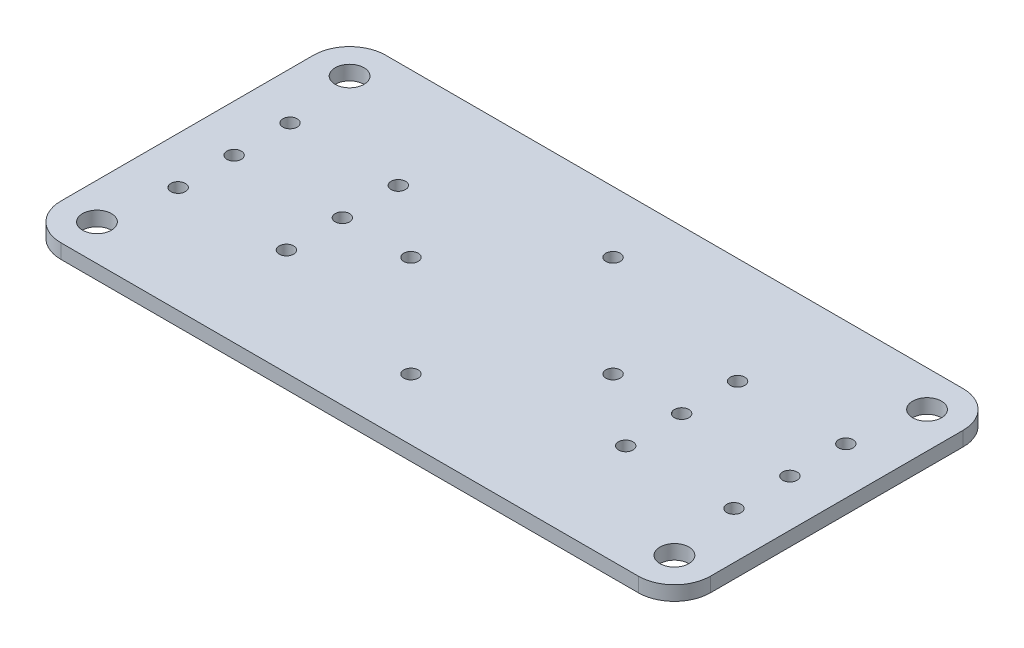
ISO-10303-21;
HEADER;
FILE_DESCRIPTION(('STEP AP214'),'2;1');
FILE_NAME('part.step','',(''),(''),'','','');
FILE_SCHEMA(('AUTOMOTIVE_DESIGN { 1 0 10303 214 1 1 1 1 }'));
ENDSEC;
DATA;
#1=APPLICATION_CONTEXT('core data for automotive mechanical design processes');
#2=APPLICATION_PROTOCOL_DEFINITION('international standard','automotive_design',2000,#1);
#3=PRODUCT_CONTEXT('',#1,'mechanical');
#4=PRODUCT('Part','Part','',(#3));
#5=PRODUCT_RELATED_PRODUCT_CATEGORY('part','',(#4));
#6=PRODUCT_DEFINITION_FORMATION('','',#4);
#7=PRODUCT_DEFINITION_CONTEXT('part definition',#1,'design');
#8=PRODUCT_DEFINITION('design','',#6,#7);
#9=PRODUCT_DEFINITION_SHAPE('','',#8);
#10=(LENGTH_UNIT() NAMED_UNIT(*) SI_UNIT(.MILLI.,.METRE.));
#11=(NAMED_UNIT(*) PLANE_ANGLE_UNIT() SI_UNIT($,.RADIAN.));
#12=(NAMED_UNIT(*) SI_UNIT($,.STERADIAN.) SOLID_ANGLE_UNIT());
#13=UNCERTAINTY_MEASURE_WITH_UNIT(LENGTH_MEASURE(1.E-05),#10,'distance_accuracy_value','');
#14=(GEOMETRIC_REPRESENTATION_CONTEXT(3) GLOBAL_UNCERTAINTY_ASSIGNED_CONTEXT((#13)) GLOBAL_UNIT_ASSIGNED_CONTEXT((#10,
#11,#12)) REPRESENTATION_CONTEXT('',''));
#15=CARTESIAN_POINT('',(0.,0.,0.));
#16=DIRECTION('',(0.,0.,1.));
#17=DIRECTION('',(1.,0.,0.));
#18=AXIS2_PLACEMENT_3D('',#15,#16,#17);
#19=CARTESIAN_POINT('',(90.,4.,45.));
#20=DIRECTION('',(-1.,0.,0.));
#21=DIRECTION('',(0.,0.,1.));
#22=AXIS2_PLACEMENT_3D('',#19,#20,#21);
#23=PLANE('',#22);
#24=DIRECTION('',(0.,0.,-1.));
#25=VECTOR('',#24,1.);
#26=CARTESIAN_POINT('',(90.,4.,45.));
#27=LINE('',#26,#25);
#28=CARTESIAN_POINT('',(90.,4.,35.));
#29=VERTEX_POINT('',#28);
#30=CARTESIAN_POINT('',(90.,4.,-35.));
#31=VERTEX_POINT('',#30);
#32=EDGE_CURVE('E122',#29,#31,#27,.T.);
#33=ORIENTED_EDGE('',*,*,#32,.F.);
#34=DIRECTION('',(0.,-1.,0.));
#35=VECTOR('',#34,1.);
#36=CARTESIAN_POINT('',(90.,4.,35.));
#37=LINE('',#36,#35);
#38=CARTESIAN_POINT('',(90.,0.,35.));
#39=VERTEX_POINT('',#38);
#40=EDGE_CURVE('E107',#29,#39,#37,.T.);
#41=ORIENTED_EDGE('',*,*,#40,.T.);
#42=DIRECTION('',(0.,0.,-1.));
#43=VECTOR('',#42,1.);
#44=CARTESIAN_POINT('',(90.,0.,45.));
#45=LINE('',#44,#43);
#46=CARTESIAN_POINT('',(90.,0.,-35.));
#47=VERTEX_POINT('',#46);
#48=EDGE_CURVE('E119',#39,#47,#45,.T.);
#49=ORIENTED_EDGE('',*,*,#48,.T.);
#50=DIRECTION('',(0.,-1.,0.));
#51=VECTOR('',#50,1.);
#52=CARTESIAN_POINT('',(90.,4.,-35.));
#53=LINE('',#52,#51);
#54=EDGE_CURVE('E124',#47,#31,#53,.F.);
#55=ORIENTED_EDGE('',*,*,#54,.T.);
#56=EDGE_LOOP('',(#33,#41,#49,#55));
#57=FACE_BOUND('',#56,.T.);
#58=ADVANCED_FACE('F37',(#57),#23,.F.);
#59=CARTESIAN_POINT('',(-90.,4.,-45.));
#60=DIRECTION('',(0.,0.,1.));
#61=DIRECTION('',(1.,0.,0.));
#62=AXIS2_PLACEMENT_3D('',#59,#60,#61);
#63=PLANE('',#62);
#64=DIRECTION('',(-1.,0.,0.));
#65=VECTOR('',#64,1.);
#66=CARTESIAN_POINT('',(-90.,4.,-45.));
#67=LINE('',#66,#65);
#68=CARTESIAN_POINT('',(79.9999999999999,4.,-45.));
#69=VERTEX_POINT('',#68);
#70=CARTESIAN_POINT('',(-80.,4.,-45.));
#71=VERTEX_POINT('',#70);
#72=EDGE_CURVE('E168',#69,#71,#67,.T.);
#73=ORIENTED_EDGE('',*,*,#72,.F.);
#74=DIRECTION('',(0.,-1.,0.));
#75=VECTOR('',#74,1.);
#76=CARTESIAN_POINT('',(80.,4.,-45.));
#77=LINE('',#76,#75);
#78=CARTESIAN_POINT('',(79.9999999999999,0.,-45.));
#79=VERTEX_POINT('',#78);
#80=EDGE_CURVE('E161',#69,#79,#77,.T.);
#81=ORIENTED_EDGE('',*,*,#80,.T.);
#82=DIRECTION('',(-1.,0.,0.));
#83=VECTOR('',#82,1.);
#84=CARTESIAN_POINT('',(-90.,0.,-45.));
#85=LINE('',#84,#83);
#86=CARTESIAN_POINT('',(-80.,0.,-45.));
#87=VERTEX_POINT('',#86);
#88=EDGE_CURVE('E128',#79,#87,#85,.T.);
#89=ORIENTED_EDGE('',*,*,#88,.T.);
#90=DIRECTION('',(0.,-1.,0.));
#91=VECTOR('',#90,1.);
#92=CARTESIAN_POINT('',(-80.,4.,-45.));
#93=LINE('',#92,#91);
#94=EDGE_CURVE('E159',#87,#71,#93,.F.);
#95=ORIENTED_EDGE('',*,*,#94,.T.);
#96=EDGE_LOOP('',(#73,#81,#89,#95));
#97=FACE_BOUND('',#96,.T.);
#98=ADVANCED_FACE('F166',(#97),#63,.F.);
#99=CARTESIAN_POINT('',(-90.,4.,45.));
#100=DIRECTION('',(1.,0.,0.));
#101=DIRECTION('',(0.,0.,-1.));
#102=AXIS2_PLACEMENT_3D('',#99,#100,#101);
#103=PLANE('',#102);
#104=DIRECTION('',(0.,0.,1.));
#105=VECTOR('',#104,1.);
#106=CARTESIAN_POINT('',(-90.,4.,45.));
#107=LINE('',#106,#105);
#108=CARTESIAN_POINT('',(-90.,4.,-35.));
#109=VERTEX_POINT('',#108);
#110=CARTESIAN_POINT('',(-90.,4.,35.));
#111=VERTEX_POINT('',#110);
#112=EDGE_CURVE('E176',#109,#111,#107,.T.);
#113=ORIENTED_EDGE('',*,*,#112,.F.);
#114=DIRECTION('',(0.,-1.,0.));
#115=VECTOR('',#114,1.);
#116=CARTESIAN_POINT('',(-90.,4.,-35.));
#117=LINE('',#116,#115);
#118=CARTESIAN_POINT('',(-90.,0.,-35.));
#119=VERTEX_POINT('',#118);
#120=EDGE_CURVE('E11',#109,#119,#117,.T.);
#121=ORIENTED_EDGE('',*,*,#120,.T.);
#122=DIRECTION('',(0.,0.,1.));
#123=VECTOR('',#122,1.);
#124=CARTESIAN_POINT('',(-90.,0.,45.));
#125=LINE('',#124,#123);
#126=CARTESIAN_POINT('',(-90.,0.,35.));
#127=VERTEX_POINT('',#126);
#128=EDGE_CURVE('E132',#119,#127,#125,.T.);
#129=ORIENTED_EDGE('',*,*,#128,.T.);
#130=DIRECTION('',(0.,-1.,0.));
#131=VECTOR('',#130,1.);
#132=CARTESIAN_POINT('',(-90.,4.,35.));
#133=LINE('',#132,#131);
#134=EDGE_CURVE('E45',#127,#111,#133,.F.);
#135=ORIENTED_EDGE('',*,*,#134,.T.);
#136=EDGE_LOOP('',(#113,#121,#129,#135));
#137=FACE_BOUND('',#136,.T.);
#138=ADVANCED_FACE('F175',(#137),#103,.F.);
#139=CARTESIAN_POINT('',(-90.,4.,45.));
#140=DIRECTION('',(0.,0.,-1.));
#141=DIRECTION('',(-1.,0.,0.));
#142=AXIS2_PLACEMENT_3D('',#139,#140,#141);
#143=PLANE('',#142);
#144=DIRECTION('',(1.,0.,0.));
#145=VECTOR('',#144,1.);
#146=CARTESIAN_POINT('',(-90.,0.,45.));
#147=LINE('',#146,#145);
#148=CARTESIAN_POINT('',(-80.,0.,45.));
#149=VERTEX_POINT('',#148);
#150=CARTESIAN_POINT('',(79.9999999999999,0.,45.));
#151=VERTEX_POINT('',#150);
#152=EDGE_CURVE('E142',#149,#151,#147,.T.);
#153=ORIENTED_EDGE('',*,*,#152,.T.);
#154=DIRECTION('',(0.,-1.,0.));
#155=VECTOR('',#154,1.);
#156=CARTESIAN_POINT('',(80.,4.,45.));
#157=LINE('',#156,#155);
#158=CARTESIAN_POINT('',(79.9999999999999,4.,45.));
#159=VERTEX_POINT('',#158);
#160=EDGE_CURVE('E108',#151,#159,#157,.F.);
#161=ORIENTED_EDGE('',*,*,#160,.T.);
#162=DIRECTION('',(1.,0.,0.));
#163=VECTOR('',#162,1.);
#164=CARTESIAN_POINT('',(-90.,4.,45.));
#165=LINE('',#164,#163);
#166=CARTESIAN_POINT('',(-80.,4.,45.));
#167=VERTEX_POINT('',#166);
#168=EDGE_CURVE('E138',#167,#159,#165,.T.);
#169=ORIENTED_EDGE('',*,*,#168,.F.);
#170=DIRECTION('',(0.,-1.,0.));
#171=VECTOR('',#170,1.);
#172=CARTESIAN_POINT('',(-80.,4.,45.));
#173=LINE('',#172,#171);
#174=EDGE_CURVE('E113',#167,#149,#173,.T.);
#175=ORIENTED_EDGE('',*,*,#174,.T.);
#176=EDGE_LOOP('',(#153,#161,#169,#175));
#177=FACE_BOUND('',#176,.T.);
#178=ADVANCED_FACE('F311',(#177),#143,.F.);
#179=CARTESIAN_POINT('',(0.,4.,0.));
#180=DIRECTION('',(0.,-1.,0.));
#181=DIRECTION('',(0.,0.,-1.));
#182=AXIS2_PLACEMENT_3D('',#179,#180,#181);
#183=PLANE('',#182);
#184=CARTESIAN_POINT('',(0.,4.,-28.));
#185=DIRECTION('',(0.,1.,0.));
#186=DIRECTION('',(0.,0.,1.));
#187=AXIS2_PLACEMENT_3D('',#184,#185,#186);
#188=CIRCLE('',#187,2.);
#189=CARTESIAN_POINT('',(0.,4.,-26.));
#190=VERTEX_POINT('',#189);
#191=EDGE_CURVE('E293',#190,#190,#188,.T.);
#192=ORIENTED_EDGE('',*,*,#191,.F.);
#193=EDGE_LOOP('',(#192));
#194=FACE_BOUND('',#193,.T.);
#195=CARTESIAN_POINT('',(-28.,4.,0.));
#196=DIRECTION('',(0.,1.,0.));
#197=DIRECTION('',(0.,0.,1.));
#198=AXIS2_PLACEMENT_3D('',#195,#196,#197);
#199=CIRCLE('',#198,2.);
#200=CARTESIAN_POINT('',(-28.,4.,2.));
#201=VERTEX_POINT('',#200);
#202=EDGE_CURVE('E290',#201,#201,#199,.T.);
#203=ORIENTED_EDGE('',*,*,#202,.F.);
#204=EDGE_LOOP('',(#203));
#205=FACE_BOUND('',#204,.T.);
#206=CARTESIAN_POINT('',(0.,4.,28.));
#207=DIRECTION('',(0.,1.,0.));
#208=DIRECTION('',(0.,0.,-1.));
#209=AXIS2_PLACEMENT_3D('',#206,#207,#208);
#210=CIRCLE('',#209,2.);
#211=CARTESIAN_POINT('',(0.,4.,26.));
#212=VERTEX_POINT('',#211);
#213=EDGE_CURVE('E284',#212,#212,#210,.T.);
#214=ORIENTED_EDGE('',*,*,#213,.F.);
#215=EDGE_LOOP('',(#214));
#216=FACE_BOUND('',#215,.T.);
#217=CARTESIAN_POINT('',(28.,4.,0.));
#218=DIRECTION('',(0.,1.,0.));
#219=DIRECTION('',(0.,0.,-1.));
#220=AXIS2_PLACEMENT_3D('',#217,#218,#219);
#221=CIRCLE('',#220,2.);
#222=CARTESIAN_POINT('',(28.,4.,-2.));
#223=VERTEX_POINT('',#222);
#224=EDGE_CURVE('E278',#223,#223,#221,.T.);
#225=ORIENTED_EDGE('',*,*,#224,.F.);
#226=EDGE_LOOP('',(#225));
#227=FACE_BOUND('',#226,.T.);
#228=CARTESIAN_POINT('',(80.,4.,-35.));
#229=DIRECTION('',(0.,1.,0.));
#230=DIRECTION('',(0.,0.,-1.));
#231=AXIS2_PLACEMENT_3D('',#228,#229,#230);
#232=CIRCLE('',#231,4.00000000000001);
#233=CARTESIAN_POINT('',(80.,4.,-39.));
#234=VERTEX_POINT('',#233);
#235=EDGE_CURVE('E260',#234,#234,#232,.T.);
#236=ORIENTED_EDGE('',*,*,#235,.F.);
#237=EDGE_LOOP('',(#236));
#238=FACE_BOUND('',#237,.T.);
#239=CARTESIAN_POINT('',(80.,4.,35.));
#240=DIRECTION('',(0.,1.,0.));
#241=DIRECTION('',(0.,0.,-1.));
#242=AXIS2_PLACEMENT_3D('',#239,#240,#241);
#243=CIRCLE('',#242,4.00000000000001);
#244=CARTESIAN_POINT('',(80.,4.,31.));
#245=VERTEX_POINT('',#244);
#246=EDGE_CURVE('E267',#245,#245,#243,.T.);
#247=ORIENTED_EDGE('',*,*,#246,.F.);
#248=EDGE_LOOP('',(#247));
#249=FACE_BOUND('',#248,.T.);
#250=CARTESIAN_POINT('',(-80.,4.,35.));
#251=DIRECTION('',(0.,1.,0.));
#252=DIRECTION('',(0.,0.,1.));
#253=AXIS2_PLACEMENT_3D('',#250,#251,#252);
#254=CIRCLE('',#253,4.00000000000001);
#255=CARTESIAN_POINT('',(-80.,4.,39.));
#256=VERTEX_POINT('',#255);
#257=EDGE_CURVE('E254',#256,#256,#254,.T.);
#258=ORIENTED_EDGE('',*,*,#257,.F.);
#259=EDGE_LOOP('',(#258));
#260=FACE_BOUND('',#259,.T.);
#261=CARTESIAN_POINT('',(-80.,4.,-35.));
#262=DIRECTION('',(0.,1.,0.));
#263=DIRECTION('',(0.,0.,1.));
#264=AXIS2_PLACEMENT_3D('',#261,#262,#263);
#265=CIRCLE('',#264,4.00000000000001);
#266=CARTESIAN_POINT('',(-80.,4.,-31.));
#267=VERTEX_POINT('',#266);
#268=EDGE_CURVE('E237',#267,#267,#265,.T.);
#269=ORIENTED_EDGE('',*,*,#268,.F.);
#270=EDGE_LOOP('',(#269));
#271=FACE_BOUND('',#270,.T.);
#272=CARTESIAN_POINT('',(-46.9999999999999,4.,15.5));
#273=DIRECTION('',(0.,1.,0.));
#274=DIRECTION('',(0.,0.,-1.));
#275=AXIS2_PLACEMENT_3D('',#272,#273,#274);
#276=CIRCLE('',#275,2.);
#277=CARTESIAN_POINT('',(-46.9999999999999,4.,13.5));
#278=VERTEX_POINT('',#277);
#279=EDGE_CURVE('E201',#278,#278,#276,.T.);
#280=ORIENTED_EDGE('',*,*,#279,.F.);
#281=EDGE_LOOP('',(#280));
#282=FACE_BOUND('',#281,.T.);
#283=CARTESIAN_POINT('',(77.,4.,0.));
#284=DIRECTION('',(0.,1.,0.));
#285=DIRECTION('',(0.,0.,-1.));
#286=AXIS2_PLACEMENT_3D('',#283,#284,#285);
#287=CIRCLE('',#286,2.);
#288=CARTESIAN_POINT('',(77.,4.,-2.));
#289=VERTEX_POINT('',#288);
#290=EDGE_CURVE('E212',#289,#289,#287,.T.);
#291=ORIENTED_EDGE('',*,*,#290,.F.);
#292=EDGE_LOOP('',(#291));
#293=FACE_BOUND('',#292,.T.);
#294=CARTESIAN_POINT('',(46.9999999999999,4.,15.5));
#295=DIRECTION('',(0.,1.,0.));
#296=DIRECTION('',(0.,0.,1.));
#297=AXIS2_PLACEMENT_3D('',#294,#295,#296);
#298=CIRCLE('',#297,2.);
#299=CARTESIAN_POINT('',(46.9999999999999,4.,17.5));
#300=VERTEX_POINT('',#299);
#301=EDGE_CURVE('E213',#300,#300,#298,.T.);
#302=ORIENTED_EDGE('',*,*,#301,.F.);
#303=EDGE_LOOP('',(#302));
#304=FACE_BOUND('',#303,.T.);
#305=CARTESIAN_POINT('',(47.,4.,0.));
#306=DIRECTION('',(0.,1.,0.));
#307=DIRECTION('',(0.,0.,-1.));
#308=AXIS2_PLACEMENT_3D('',#305,#306,#307);
#309=CIRCLE('',#308,2.);
#310=CARTESIAN_POINT('',(47.,4.,-2.));
#311=VERTEX_POINT('',#310);
#312=EDGE_CURVE('E224',#311,#311,#309,.T.);
#313=ORIENTED_EDGE('',*,*,#312,.F.);
#314=EDGE_LOOP('',(#313));
#315=FACE_BOUND('',#314,.T.);
#316=CARTESIAN_POINT('',(-77.,4.,-15.5));
#317=DIRECTION('',(0.,1.,0.));
#318=DIRECTION('',(0.,0.,1.));
#319=AXIS2_PLACEMENT_3D('',#316,#317,#318);
#320=CIRCLE('',#319,2.);
#321=CARTESIAN_POINT('',(-77.,4.,-13.5));
#322=VERTEX_POINT('',#321);
#323=EDGE_CURVE('E183',#322,#322,#320,.T.);
#324=ORIENTED_EDGE('',*,*,#323,.F.);
#325=EDGE_LOOP('',(#324));
#326=FACE_BOUND('',#325,.T.);
#327=CARTESIAN_POINT('',(-77.,4.,0.));
#328=DIRECTION('',(0.,1.,0.));
#329=DIRECTION('',(0.,0.,1.));
#330=AXIS2_PLACEMENT_3D('',#327,#328,#329);
#331=CIRCLE('',#330,2.);
#332=CARTESIAN_POINT('',(-77.,4.,2.));
#333=VERTEX_POINT('',#332);
#334=EDGE_CURVE('E188',#333,#333,#331,.T.);
#335=ORIENTED_EDGE('',*,*,#334,.F.);
#336=EDGE_LOOP('',(#335));
#337=FACE_BOUND('',#336,.T.);
#338=CARTESIAN_POINT('',(-47.,4.,-15.5));
#339=DIRECTION('',(0.,1.,0.));
#340=DIRECTION('',(0.,0.,1.));
#341=AXIS2_PLACEMENT_3D('',#338,#339,#340);
#342=CIRCLE('',#341,2.);
#343=CARTESIAN_POINT('',(-47.,4.,-13.5));
#344=VERTEX_POINT('',#343);
#345=EDGE_CURVE('E189',#344,#344,#342,.T.);
#346=ORIENTED_EDGE('',*,*,#345,.F.);
#347=EDGE_LOOP('',(#346));
#348=FACE_BOUND('',#347,.T.);
#349=CARTESIAN_POINT('',(-76.9999999999999,4.,15.5));
#350=DIRECTION('',(0.,1.,0.));
#351=DIRECTION('',(0.,0.,-1.));
#352=AXIS2_PLACEMENT_3D('',#349,#350,#351);
#353=CIRCLE('',#352,2.);
#354=CARTESIAN_POINT('',(-76.9999999999999,4.,13.5));
#355=VERTEX_POINT('',#354);
#356=EDGE_CURVE('E200',#355,#355,#353,.T.);
#357=ORIENTED_EDGE('',*,*,#356,.F.);
#358=EDGE_LOOP('',(#357));
#359=FACE_BOUND('',#358,.T.);
#360=CARTESIAN_POINT('',(76.9999999999999,4.,15.5));
#361=DIRECTION('',(0.,1.,0.));
#362=DIRECTION('',(0.,0.,1.));
#363=AXIS2_PLACEMENT_3D('',#360,#361,#362);
#364=CIRCLE('',#363,2.);
#365=CARTESIAN_POINT('',(76.9999999999999,4.,17.5));
#366=VERTEX_POINT('',#365);
#367=EDGE_CURVE('E225',#366,#366,#364,.T.);
#368=ORIENTED_EDGE('',*,*,#367,.F.);
#369=EDGE_LOOP('',(#368));
#370=FACE_BOUND('',#369,.T.);
#371=CARTESIAN_POINT('',(77.,4.,-15.5));
#372=DIRECTION('',(0.,1.,0.));
#373=DIRECTION('',(0.,0.,-1.));
#374=AXIS2_PLACEMENT_3D('',#371,#372,#373);
#375=CIRCLE('',#374,2.);
#376=CARTESIAN_POINT('',(77.,4.,-17.5));
#377=VERTEX_POINT('',#376);
#378=EDGE_CURVE('E243',#377,#377,#375,.T.);
#379=ORIENTED_EDGE('',*,*,#378,.F.);
#380=EDGE_LOOP('',(#379));
#381=FACE_BOUND('',#380,.T.);
#382=CARTESIAN_POINT('',(47.,4.,-15.5));
#383=DIRECTION('',(0.,1.,0.));
#384=DIRECTION('',(0.,0.,-1.));
#385=AXIS2_PLACEMENT_3D('',#382,#383,#384);
#386=CIRCLE('',#385,2.);
#387=CARTESIAN_POINT('',(47.,4.,-17.5));
#388=VERTEX_POINT('',#387);
#389=EDGE_CURVE('E236',#388,#388,#386,.T.);
#390=ORIENTED_EDGE('',*,*,#389,.F.);
#391=EDGE_LOOP('',(#390));
#392=FACE_BOUND('',#391,.T.);
#393=CARTESIAN_POINT('',(-47.,4.,0.));
#394=DIRECTION('',(0.,1.,0.));
#395=DIRECTION('',(0.,0.,1.));
#396=AXIS2_PLACEMENT_3D('',#393,#394,#395);
#397=CIRCLE('',#396,2.);
#398=CARTESIAN_POINT('',(-47.,4.,2.));
#399=VERTEX_POINT('',#398);
#400=EDGE_CURVE('E129',#399,#399,#397,.T.);
#401=ORIENTED_EDGE('',*,*,#400,.F.);
#402=EDGE_LOOP('',(#401));
#403=FACE_BOUND('',#402,.T.);
#404=ORIENTED_EDGE('',*,*,#168,.T.);
#405=CARTESIAN_POINT('',(80.,4.,35.));
#406=DIRECTION('',(0.,-1.,0.));
#407=DIRECTION('',(0.,0.,-1.));
#408=AXIS2_PLACEMENT_3D('',#405,#406,#407);
#409=CIRCLE('',#408,10.);
#410=EDGE_CURVE('E157',#159,#29,#409,.F.);
#411=ORIENTED_EDGE('',*,*,#410,.T.);
#412=ORIENTED_EDGE('',*,*,#32,.T.);
#413=CARTESIAN_POINT('',(80.,4.,-35.));
#414=DIRECTION('',(0.,-1.,0.));
#415=DIRECTION('',(0.,0.,-1.));
#416=AXIS2_PLACEMENT_3D('',#413,#414,#415);
#417=CIRCLE('',#416,10.);
#418=EDGE_CURVE('E155',#31,#69,#417,.F.);
#419=ORIENTED_EDGE('',*,*,#418,.T.);
#420=ORIENTED_EDGE('',*,*,#72,.T.);
#421=CARTESIAN_POINT('',(-80.,4.,-35.));
#422=DIRECTION('',(0.,-1.,0.));
#423=DIRECTION('',(0.,0.,-1.));
#424=AXIS2_PLACEMENT_3D('',#421,#422,#423);
#425=CIRCLE('',#424,10.);
#426=EDGE_CURVE('E58',#71,#109,#425,.F.);
#427=ORIENTED_EDGE('',*,*,#426,.T.);
#428=ORIENTED_EDGE('',*,*,#112,.T.);
#429=CARTESIAN_POINT('',(-80.,4.,35.));
#430=DIRECTION('',(0.,-1.,0.));
#431=DIRECTION('',(0.,0.,-1.));
#432=AXIS2_PLACEMENT_3D('',#429,#430,#431);
#433=CIRCLE('',#432,10.);
#434=EDGE_CURVE('E152',#111,#167,#433,.F.);
#435=ORIENTED_EDGE('',*,*,#434,.T.);
#436=EDGE_LOOP('',(#404,#411,#412,#419,#420,#427,#428,#435));
#437=FACE_BOUND('',#436,.T.);
#438=ADVANCED_FACE('F308',(#194,#205,#216,#227,#238,#249,#260,#271,#282,#293,#304,#315,#326,
#337,#348,#359,#370,#381,#392,#403,#437),#183,.F.);
#439=CARTESIAN_POINT('',(0.,0.,0.));
#440=DIRECTION('',(0.,-1.,0.));
#441=DIRECTION('',(0.,0.,-1.));
#442=AXIS2_PLACEMENT_3D('',#439,#440,#441);
#443=PLANE('',#442);
#444=CARTESIAN_POINT('',(0.,0.,-28.));
#445=DIRECTION('',(0.,1.,0.));
#446=DIRECTION('',(0.,0.,1.));
#447=AXIS2_PLACEMENT_3D('',#444,#445,#446);
#448=CIRCLE('',#447,2.);
#449=CARTESIAN_POINT('',(0.,0.,-26.));
#450=VERTEX_POINT('',#449);
#451=EDGE_CURVE('E261',#450,#450,#448,.T.);
#452=ORIENTED_EDGE('',*,*,#451,.T.);
#453=EDGE_LOOP('',(#452));
#454=FACE_BOUND('',#453,.T.);
#455=CARTESIAN_POINT('',(-28.,0.,0.));
#456=DIRECTION('',(0.,1.,0.));
#457=DIRECTION('',(0.,0.,1.));
#458=AXIS2_PLACEMENT_3D('',#455,#456,#457);
#459=CIRCLE('',#458,2.);
#460=CARTESIAN_POINT('',(-28.,0.,2.));
#461=VERTEX_POINT('',#460);
#462=EDGE_CURVE('E287',#461,#461,#459,.T.);
#463=ORIENTED_EDGE('',*,*,#462,.T.);
#464=EDGE_LOOP('',(#463));
#465=FACE_BOUND('',#464,.T.);
#466=CARTESIAN_POINT('',(0.,0.,28.));
#467=DIRECTION('',(0.,1.,0.));
#468=DIRECTION('',(0.,0.,-1.));
#469=AXIS2_PLACEMENT_3D('',#466,#467,#468);
#470=CIRCLE('',#469,2.);
#471=CARTESIAN_POINT('',(0.,0.,26.));
#472=VERTEX_POINT('',#471);
#473=EDGE_CURVE('E281',#472,#472,#470,.T.);
#474=ORIENTED_EDGE('',*,*,#473,.T.);
#475=EDGE_LOOP('',(#474));
#476=FACE_BOUND('',#475,.T.);
#477=CARTESIAN_POINT('',(28.,0.,0.));
#478=DIRECTION('',(0.,1.,0.));
#479=DIRECTION('',(0.,0.,-1.));
#480=AXIS2_PLACEMENT_3D('',#477,#478,#479);
#481=CIRCLE('',#480,2.);
#482=CARTESIAN_POINT('',(28.,0.,-2.));
#483=VERTEX_POINT('',#482);
#484=EDGE_CURVE('E275',#483,#483,#481,.T.);
#485=ORIENTED_EDGE('',*,*,#484,.T.);
#486=EDGE_LOOP('',(#485));
#487=FACE_BOUND('',#486,.T.);
#488=CARTESIAN_POINT('',(80.,0.,-35.));
#489=DIRECTION('',(0.,-1.,0.));
#490=DIRECTION('',(0.,0.,-1.));
#491=AXIS2_PLACEMENT_3D('',#488,#489,#490);
#492=CIRCLE('',#491,4.00000000000001);
#493=CARTESIAN_POINT('',(80.,0.,-39.));
#494=VERTEX_POINT('',#493);
#495=EDGE_CURVE('E257',#494,#494,#492,.F.);
#496=ORIENTED_EDGE('',*,*,#495,.T.);
#497=EDGE_LOOP('',(#496));
#498=FACE_BOUND('',#497,.T.);
#499=CARTESIAN_POINT('',(80.,0.,35.));
#500=DIRECTION('',(0.,-1.,0.));
#501=DIRECTION('',(0.,0.,-1.));
#502=AXIS2_PLACEMENT_3D('',#499,#500,#501);
#503=CIRCLE('',#502,4.00000000000001);
#504=CARTESIAN_POINT('',(80.,0.,31.));
#505=VERTEX_POINT('',#504);
#506=EDGE_CURVE('E264',#505,#505,#503,.F.);
#507=ORIENTED_EDGE('',*,*,#506,.T.);
#508=EDGE_LOOP('',(#507));
#509=FACE_BOUND('',#508,.T.);
#510=CARTESIAN_POINT('',(-80.,0.,35.));
#511=DIRECTION('',(0.,-1.,0.));
#512=DIRECTION('',(0.,0.,-1.));
#513=AXIS2_PLACEMENT_3D('',#510,#511,#512);
#514=CIRCLE('',#513,4.00000000000001);
#515=CARTESIAN_POINT('',(-80.,0.,31.));
#516=VERTEX_POINT('',#515);
#517=EDGE_CURVE('E270',#516,#516,#514,.F.);
#518=ORIENTED_EDGE('',*,*,#517,.T.);
#519=EDGE_LOOP('',(#518));
#520=FACE_BOUND('',#519,.T.);
#521=CARTESIAN_POINT('',(-80.,0.,-35.));
#522=DIRECTION('',(0.,-1.,0.));
#523=DIRECTION('',(0.,0.,-1.));
#524=AXIS2_PLACEMENT_3D('',#521,#522,#523);
#525=CIRCLE('',#524,4.00000000000001);
#526=CARTESIAN_POINT('',(-80.,0.,-39.));
#527=VERTEX_POINT('',#526);
#528=EDGE_CURVE('E251',#527,#527,#525,.F.);
#529=ORIENTED_EDGE('',*,*,#528,.T.);
#530=EDGE_LOOP('',(#529));
#531=FACE_BOUND('',#530,.T.);
#532=CARTESIAN_POINT('',(-46.9999999999999,0.,15.5));
#533=DIRECTION('',(0.,-1.,0.));
#534=DIRECTION('',(0.,0.,-1.));
#535=AXIS2_PLACEMENT_3D('',#532,#533,#534);
#536=CIRCLE('',#535,2.);
#537=CARTESIAN_POINT('',(-46.9999999999999,0.,13.5));
#538=VERTEX_POINT('',#537);
#539=EDGE_CURVE('E216',#538,#538,#536,.F.);
#540=ORIENTED_EDGE('',*,*,#539,.T.);
#541=EDGE_LOOP('',(#540));
#542=FACE_BOUND('',#541,.T.);
#543=CARTESIAN_POINT('',(77.,0.,0.));
#544=DIRECTION('',(0.,-1.,0.));
#545=DIRECTION('',(0.,0.,-1.));
#546=AXIS2_PLACEMENT_3D('',#543,#544,#545);
#547=CIRCLE('',#546,2.);
#548=CARTESIAN_POINT('',(77.,0.,-2.));
#549=VERTEX_POINT('',#548);
#550=EDGE_CURVE('E209',#549,#549,#547,.F.);
#551=ORIENTED_EDGE('',*,*,#550,.T.);
#552=EDGE_LOOP('',(#551));
#553=FACE_BOUND('',#552,.T.);
#554=CARTESIAN_POINT('',(46.9999999999999,0.,15.5));
#555=DIRECTION('',(0.,-1.,0.));
#556=DIRECTION('',(0.,0.,-1.));
#557=AXIS2_PLACEMENT_3D('',#554,#555,#556);
#558=CIRCLE('',#557,2.);
#559=CARTESIAN_POINT('',(46.9999999999999,0.,13.5));
#560=VERTEX_POINT('',#559);
#561=EDGE_CURVE('E228',#560,#560,#558,.F.);
#562=ORIENTED_EDGE('',*,*,#561,.T.);
#563=EDGE_LOOP('',(#562));
#564=FACE_BOUND('',#563,.T.);
#565=CARTESIAN_POINT('',(47.,0.,0.));
#566=DIRECTION('',(0.,-1.,0.));
#567=DIRECTION('',(0.,0.,-1.));
#568=AXIS2_PLACEMENT_3D('',#565,#566,#567);
#569=CIRCLE('',#568,2.);
#570=CARTESIAN_POINT('',(47.,0.,-2.));
#571=VERTEX_POINT('',#570);
#572=EDGE_CURVE('E221',#571,#571,#569,.F.);
#573=ORIENTED_EDGE('',*,*,#572,.T.);
#574=EDGE_LOOP('',(#573));
#575=FACE_BOUND('',#574,.T.);
#576=CARTESIAN_POINT('',(-77.,0.,-15.5));
#577=DIRECTION('',(0.,-1.,0.));
#578=DIRECTION('',(0.,0.,-1.));
#579=AXIS2_PLACEMENT_3D('',#576,#577,#578);
#580=CIRCLE('',#579,2.);
#581=CARTESIAN_POINT('',(-77.,0.,-17.5));
#582=VERTEX_POINT('',#581);
#583=EDGE_CURVE('E192',#582,#582,#580,.F.);
#584=ORIENTED_EDGE('',*,*,#583,.T.);
#585=EDGE_LOOP('',(#584));
#586=FACE_BOUND('',#585,.T.);
#587=CARTESIAN_POINT('',(-77.,0.,0.));
#588=DIRECTION('',(0.,-1.,0.));
#589=DIRECTION('',(0.,0.,-1.));
#590=AXIS2_PLACEMENT_3D('',#587,#588,#589);
#591=CIRCLE('',#590,2.);
#592=CARTESIAN_POINT('',(-77.,0.,-2.));
#593=VERTEX_POINT('',#592);
#594=EDGE_CURVE('E185',#593,#593,#591,.F.);
#595=ORIENTED_EDGE('',*,*,#594,.T.);
#596=EDGE_LOOP('',(#595));
#597=FACE_BOUND('',#596,.T.);
#598=CARTESIAN_POINT('',(-47.,0.,-15.5));
#599=DIRECTION('',(0.,-1.,0.));
#600=DIRECTION('',(0.,0.,-1.));
#601=AXIS2_PLACEMENT_3D('',#598,#599,#600);
#602=CIRCLE('',#601,2.);
#603=CARTESIAN_POINT('',(-47.,0.,-17.5));
#604=VERTEX_POINT('',#603);
#605=EDGE_CURVE('E204',#604,#604,#602,.F.);
#606=ORIENTED_EDGE('',*,*,#605,.T.);
#607=EDGE_LOOP('',(#606));
#608=FACE_BOUND('',#607,.T.);
#609=CARTESIAN_POINT('',(-76.9999999999999,0.,15.5));
#610=DIRECTION('',(0.,-1.,0.));
#611=DIRECTION('',(0.,0.,-1.));
#612=AXIS2_PLACEMENT_3D('',#609,#610,#611);
#613=CIRCLE('',#612,2.);
#614=CARTESIAN_POINT('',(-76.9999999999999,0.,13.5));
#615=VERTEX_POINT('',#614);
#616=EDGE_CURVE('E197',#615,#615,#613,.F.);
#617=ORIENTED_EDGE('',*,*,#616,.T.);
#618=EDGE_LOOP('',(#617));
#619=FACE_BOUND('',#618,.T.);
#620=CARTESIAN_POINT('',(76.9999999999999,0.,15.5));
#621=DIRECTION('',(0.,-1.,0.));
#622=DIRECTION('',(0.,0.,-1.));
#623=AXIS2_PLACEMENT_3D('',#620,#621,#622);
#624=CIRCLE('',#623,2.);
#625=CARTESIAN_POINT('',(76.9999999999999,0.,13.5));
#626=VERTEX_POINT('',#625);
#627=EDGE_CURVE('E246',#626,#626,#624,.F.);
#628=ORIENTED_EDGE('',*,*,#627,.T.);
#629=EDGE_LOOP('',(#628));
#630=FACE_BOUND('',#629,.T.);
#631=CARTESIAN_POINT('',(77.,0.,-15.5));
#632=DIRECTION('',(0.,-1.,0.));
#633=DIRECTION('',(0.,0.,-1.));
#634=AXIS2_PLACEMENT_3D('',#631,#632,#633);
#635=CIRCLE('',#634,2.);
#636=CARTESIAN_POINT('',(77.,0.,-17.5));
#637=VERTEX_POINT('',#636);
#638=EDGE_CURVE('E240',#637,#637,#635,.F.);
#639=ORIENTED_EDGE('',*,*,#638,.T.);
#640=EDGE_LOOP('',(#639));
#641=FACE_BOUND('',#640,.T.);
#642=CARTESIAN_POINT('',(47.,0.,-15.5));
#643=DIRECTION('',(0.,-1.,0.));
#644=DIRECTION('',(0.,0.,-1.));
#645=AXIS2_PLACEMENT_3D('',#642,#643,#644);
#646=CIRCLE('',#645,2.);
#647=CARTESIAN_POINT('',(47.,0.,-17.5));
#648=VERTEX_POINT('',#647);
#649=EDGE_CURVE('E233',#648,#648,#646,.F.);
#650=ORIENTED_EDGE('',*,*,#649,.T.);
#651=EDGE_LOOP('',(#650));
#652=FACE_BOUND('',#651,.T.);
#653=CARTESIAN_POINT('',(-47.,0.,0.));
#654=DIRECTION('',(0.,-1.,0.));
#655=DIRECTION('',(0.,0.,-1.));
#656=AXIS2_PLACEMENT_3D('',#653,#654,#655);
#657=CIRCLE('',#656,2.);
#658=CARTESIAN_POINT('',(-47.,0.,-2.));
#659=VERTEX_POINT('',#658);
#660=EDGE_CURVE('E135',#659,#659,#657,.F.);
#661=ORIENTED_EDGE('',*,*,#660,.T.);
#662=EDGE_LOOP('',(#661));
#663=FACE_BOUND('',#662,.T.);
#664=ORIENTED_EDGE('',*,*,#48,.F.);
#665=CARTESIAN_POINT('',(80.,0.,35.));
#666=DIRECTION('',(0.,-1.,0.));
#667=DIRECTION('',(0.,0.,-1.));
#668=AXIS2_PLACEMENT_3D('',#665,#666,#667);
#669=CIRCLE('',#668,10.);
#670=EDGE_CURVE('E103',#39,#151,#669,.T.);
#671=ORIENTED_EDGE('',*,*,#670,.T.);
#672=ORIENTED_EDGE('',*,*,#152,.F.);
#673=CARTESIAN_POINT('',(-80.,0.,35.));
#674=DIRECTION('',(0.,-1.,0.));
#675=DIRECTION('',(0.,0.,-1.));
#676=AXIS2_PLACEMENT_3D('',#673,#674,#675);
#677=CIRCLE('',#676,10.);
#678=EDGE_CURVE('E123',#149,#127,#677,.T.);
#679=ORIENTED_EDGE('',*,*,#678,.T.);
#680=ORIENTED_EDGE('',*,*,#128,.F.);
#681=CARTESIAN_POINT('',(-80.,0.,-35.));
#682=DIRECTION('',(0.,-1.,0.));
#683=DIRECTION('',(0.,0.,-1.));
#684=AXIS2_PLACEMENT_3D('',#681,#682,#683);
#685=CIRCLE('',#684,10.);
#686=EDGE_CURVE('E146',#119,#87,#685,.T.);
#687=ORIENTED_EDGE('',*,*,#686,.T.);
#688=ORIENTED_EDGE('',*,*,#88,.F.);
#689=CARTESIAN_POINT('',(80.,0.,-35.));
#690=DIRECTION('',(0.,-1.,0.));
#691=DIRECTION('',(0.,0.,-1.));
#692=AXIS2_PLACEMENT_3D('',#689,#690,#691);
#693=CIRCLE('',#692,10.);
#694=EDGE_CURVE('E114',#79,#47,#693,.T.);
#695=ORIENTED_EDGE('',*,*,#694,.T.);
#696=EDGE_LOOP('',(#664,#671,#672,#679,#680,#687,#688,#695));
#697=FACE_BOUND('',#696,.T.);
#698=ADVANCED_FACE('F126',(#454,#465,#476,#487,#498,#509,#520,#531,#542,#553,#564,#575,#586,
#597,#608,#619,#630,#641,#652,#663,#697),#443,.T.);
#699=CARTESIAN_POINT('',(80.,4.,35.));
#700=DIRECTION('',(0.,-1.,0.));
#701=DIRECTION('',(0.,0.,-1.));
#702=AXIS2_PLACEMENT_3D('',#699,#700,#701);
#703=CYLINDRICAL_SURFACE('',#702,10.);
#704=ORIENTED_EDGE('',*,*,#410,.F.);
#705=ORIENTED_EDGE('',*,*,#160,.F.);
#706=ORIENTED_EDGE('',*,*,#670,.F.);
#707=ORIENTED_EDGE('',*,*,#40,.F.);
#708=EDGE_LOOP('',(#704,#705,#706,#707));
#709=FACE_BOUND('',#708,.T.);
#710=ADVANCED_FACE('F106',(#709),#703,.T.);
#711=CARTESIAN_POINT('',(80.,4.,-35.));
#712=DIRECTION('',(0.,-1.,0.));
#713=DIRECTION('',(0.,0.,-1.));
#714=AXIS2_PLACEMENT_3D('',#711,#712,#713);
#715=CYLINDRICAL_SURFACE('',#714,10.);
#716=ORIENTED_EDGE('',*,*,#418,.F.);
#717=ORIENTED_EDGE('',*,*,#54,.F.);
#718=ORIENTED_EDGE('',*,*,#694,.F.);
#719=ORIENTED_EDGE('',*,*,#80,.F.);
#720=EDGE_LOOP('',(#716,#717,#718,#719));
#721=FACE_BOUND('',#720,.T.);
#722=ADVANCED_FACE('F363',(#721),#715,.T.);
#723=CARTESIAN_POINT('',(-80.,4.,-35.));
#724=DIRECTION('',(0.,-1.,0.));
#725=DIRECTION('',(0.,0.,-1.));
#726=AXIS2_PLACEMENT_3D('',#723,#724,#725);
#727=CYLINDRICAL_SURFACE('',#726,10.);
#728=ORIENTED_EDGE('',*,*,#426,.F.);
#729=ORIENTED_EDGE('',*,*,#94,.F.);
#730=ORIENTED_EDGE('',*,*,#686,.F.);
#731=ORIENTED_EDGE('',*,*,#120,.F.);
#732=EDGE_LOOP('',(#728,#729,#730,#731));
#733=FACE_BOUND('',#732,.T.);
#734=ADVANCED_FACE('F174',(#733),#727,.T.);
#735=CARTESIAN_POINT('',(-80.,4.,35.));
#736=DIRECTION('',(0.,-1.,0.));
#737=DIRECTION('',(0.,0.,-1.));
#738=AXIS2_PLACEMENT_3D('',#735,#736,#737);
#739=CYLINDRICAL_SURFACE('',#738,10.);
#740=ORIENTED_EDGE('',*,*,#434,.F.);
#741=ORIENTED_EDGE('',*,*,#134,.F.);
#742=ORIENTED_EDGE('',*,*,#678,.F.);
#743=ORIENTED_EDGE('',*,*,#174,.F.);
#744=EDGE_LOOP('',(#740,#741,#742,#743));
#745=FACE_BOUND('',#744,.T.);
#746=ADVANCED_FACE('F39',(#745),#739,.T.);
#747=CARTESIAN_POINT('',(-47.,-0.00100000000000013,0.));
#748=DIRECTION('',(0.,1.,0.));
#749=DIRECTION('',(0.,0.,1.));
#750=AXIS2_PLACEMENT_3D('',#747,#748,#749);
#751=CYLINDRICAL_SURFACE('',#750,2.);
#752=ORIENTED_EDGE('',*,*,#660,.F.);
#753=EDGE_LOOP('',(#752));
#754=FACE_BOUND('',#753,.T.);
#755=ORIENTED_EDGE('',*,*,#400,.T.);
#756=EDGE_LOOP('',(#755));
#757=FACE_BOUND('',#756,.T.);
#758=ADVANCED_FACE('F355',(#754,#757),#751,.F.);
#759=CARTESIAN_POINT('',(47.,-0.00100000000000013,-15.5));
#760=DIRECTION('',(0.,1.,0.));
#761=DIRECTION('',(0.,0.,1.));
#762=AXIS2_PLACEMENT_3D('',#759,#760,#761);
#763=CYLINDRICAL_SURFACE('',#762,2.);
#764=ORIENTED_EDGE('',*,*,#649,.F.);
#765=EDGE_LOOP('',(#764));
#766=FACE_BOUND('',#765,.T.);
#767=ORIENTED_EDGE('',*,*,#389,.T.);
#768=EDGE_LOOP('',(#767));
#769=FACE_BOUND('',#768,.T.);
#770=ADVANCED_FACE('F360',(#766,#769),#763,.F.);
#771=CARTESIAN_POINT('',(77.,-0.00100000000000013,-15.5));
#772=DIRECTION('',(0.,1.,0.));
#773=DIRECTION('',(0.,0.,1.));
#774=AXIS2_PLACEMENT_3D('',#771,#772,#773);
#775=CYLINDRICAL_SURFACE('',#774,2.);
#776=ORIENTED_EDGE('',*,*,#638,.F.);
#777=EDGE_LOOP('',(#776));
#778=FACE_BOUND('',#777,.T.);
#779=ORIENTED_EDGE('',*,*,#378,.T.);
#780=EDGE_LOOP('',(#779));
#781=FACE_BOUND('',#780,.T.);
#782=ADVANCED_FACE('F403',(#778,#781),#775,.F.);
#783=CARTESIAN_POINT('',(76.9999999999999,-0.00100000000000013,15.5));
#784=DIRECTION('',(0.,1.,0.));
#785=DIRECTION('',(0.,0.,1.));
#786=AXIS2_PLACEMENT_3D('',#783,#784,#785);
#787=CYLINDRICAL_SURFACE('',#786,2.);
#788=ORIENTED_EDGE('',*,*,#627,.F.);
#789=EDGE_LOOP('',(#788));
#790=FACE_BOUND('',#789,.T.);
#791=ORIENTED_EDGE('',*,*,#367,.T.);
#792=EDGE_LOOP('',(#791));
#793=FACE_BOUND('',#792,.T.);
#794=ADVANCED_FACE('F413',(#790,#793),#787,.F.);
#795=CARTESIAN_POINT('',(-76.9999999999999,-0.00100000000000013,15.5));
#796=DIRECTION('',(0.,1.,0.));
#797=DIRECTION('',(0.,0.,1.));
#798=AXIS2_PLACEMENT_3D('',#795,#796,#797);
#799=CYLINDRICAL_SURFACE('',#798,2.);
#800=ORIENTED_EDGE('',*,*,#616,.F.);
#801=EDGE_LOOP('',(#800));
#802=FACE_BOUND('',#801,.T.);
#803=ORIENTED_EDGE('',*,*,#356,.T.);
#804=EDGE_LOOP('',(#803));
#805=FACE_BOUND('',#804,.T.);
#806=ADVANCED_FACE('F423',(#802,#805),#799,.F.);
#807=CARTESIAN_POINT('',(-47.,-0.00100000000000013,-15.5));
#808=DIRECTION('',(0.,1.,0.));
#809=DIRECTION('',(0.,0.,1.));
#810=AXIS2_PLACEMENT_3D('',#807,#808,#809);
#811=CYLINDRICAL_SURFACE('',#810,2.);
#812=ORIENTED_EDGE('',*,*,#605,.F.);
#813=EDGE_LOOP('',(#812));
#814=FACE_BOUND('',#813,.T.);
#815=ORIENTED_EDGE('',*,*,#345,.T.);
#816=EDGE_LOOP('',(#815));
#817=FACE_BOUND('',#816,.T.);
#818=ADVANCED_FACE('F433',(#814,#817),#811,.F.);
#819=CARTESIAN_POINT('',(-77.,-0.00100000000000013,0.));
#820=DIRECTION('',(0.,1.,0.));
#821=DIRECTION('',(0.,0.,1.));
#822=AXIS2_PLACEMENT_3D('',#819,#820,#821);
#823=CYLINDRICAL_SURFACE('',#822,2.);
#824=ORIENTED_EDGE('',*,*,#594,.F.);
#825=EDGE_LOOP('',(#824));
#826=FACE_BOUND('',#825,.T.);
#827=ORIENTED_EDGE('',*,*,#334,.T.);
#828=EDGE_LOOP('',(#827));
#829=FACE_BOUND('',#828,.T.);
#830=ADVANCED_FACE('F443',(#826,#829),#823,.F.);
#831=CARTESIAN_POINT('',(-77.,-0.00100000000000013,-15.5));
#832=DIRECTION('',(0.,1.,0.));
#833=DIRECTION('',(0.,0.,1.));
#834=AXIS2_PLACEMENT_3D('',#831,#832,#833);
#835=CYLINDRICAL_SURFACE('',#834,2.);
#836=ORIENTED_EDGE('',*,*,#583,.F.);
#837=EDGE_LOOP('',(#836));
#838=FACE_BOUND('',#837,.T.);
#839=ORIENTED_EDGE('',*,*,#323,.T.);
#840=EDGE_LOOP('',(#839));
#841=FACE_BOUND('',#840,.T.);
#842=ADVANCED_FACE('F453',(#838,#841),#835,.F.);
#843=CARTESIAN_POINT('',(47.,-0.00100000000000013,0.));
#844=DIRECTION('',(0.,1.,0.));
#845=DIRECTION('',(0.,0.,1.));
#846=AXIS2_PLACEMENT_3D('',#843,#844,#845);
#847=CYLINDRICAL_SURFACE('',#846,2.);
#848=ORIENTED_EDGE('',*,*,#572,.F.);
#849=EDGE_LOOP('',(#848));
#850=FACE_BOUND('',#849,.T.);
#851=ORIENTED_EDGE('',*,*,#312,.T.);
#852=EDGE_LOOP('',(#851));
#853=FACE_BOUND('',#852,.T.);
#854=ADVANCED_FACE('F463',(#850,#853),#847,.F.);
#855=CARTESIAN_POINT('',(46.9999999999999,-0.00100000000000013,15.5));
#856=DIRECTION('',(0.,1.,0.));
#857=DIRECTION('',(0.,0.,1.));
#858=AXIS2_PLACEMENT_3D('',#855,#856,#857);
#859=CYLINDRICAL_SURFACE('',#858,2.);
#860=ORIENTED_EDGE('',*,*,#561,.F.);
#861=EDGE_LOOP('',(#860));
#862=FACE_BOUND('',#861,.T.);
#863=ORIENTED_EDGE('',*,*,#301,.T.);
#864=EDGE_LOOP('',(#863));
#865=FACE_BOUND('',#864,.T.);
#866=ADVANCED_FACE('F473',(#862,#865),#859,.F.);
#867=CARTESIAN_POINT('',(77.,-0.00100000000000013,0.));
#868=DIRECTION('',(0.,1.,0.));
#869=DIRECTION('',(0.,0.,1.));
#870=AXIS2_PLACEMENT_3D('',#867,#868,#869);
#871=CYLINDRICAL_SURFACE('',#870,2.);
#872=ORIENTED_EDGE('',*,*,#550,.F.);
#873=EDGE_LOOP('',(#872));
#874=FACE_BOUND('',#873,.T.);
#875=ORIENTED_EDGE('',*,*,#290,.T.);
#876=EDGE_LOOP('',(#875));
#877=FACE_BOUND('',#876,.T.);
#878=ADVANCED_FACE('F483',(#874,#877),#871,.F.);
#879=CARTESIAN_POINT('',(-46.9999999999999,-0.00100000000000013,15.5));
#880=DIRECTION('',(0.,1.,0.));
#881=DIRECTION('',(0.,0.,1.));
#882=AXIS2_PLACEMENT_3D('',#879,#880,#881);
#883=CYLINDRICAL_SURFACE('',#882,2.);
#884=ORIENTED_EDGE('',*,*,#539,.F.);
#885=EDGE_LOOP('',(#884));
#886=FACE_BOUND('',#885,.T.);
#887=ORIENTED_EDGE('',*,*,#279,.T.);
#888=EDGE_LOOP('',(#887));
#889=FACE_BOUND('',#888,.T.);
#890=ADVANCED_FACE('F493',(#886,#889),#883,.F.);
#891=CARTESIAN_POINT('',(-80.,-0.00100000000000013,-35.));
#892=DIRECTION('',(0.,1.,0.));
#893=DIRECTION('',(0.,0.,1.));
#894=AXIS2_PLACEMENT_3D('',#891,#892,#893);
#895=CYLINDRICAL_SURFACE('',#894,4.00000000000001);
#896=ORIENTED_EDGE('',*,*,#528,.F.);
#897=EDGE_LOOP('',(#896));
#898=FACE_BOUND('',#897,.T.);
#899=ORIENTED_EDGE('',*,*,#268,.T.);
#900=EDGE_LOOP('',(#899));
#901=FACE_BOUND('',#900,.T.);
#902=ADVANCED_FACE('F503',(#898,#901),#895,.F.);
#903=CARTESIAN_POINT('',(-80.,-0.00100000000000013,35.));
#904=DIRECTION('',(0.,1.,0.));
#905=DIRECTION('',(0.,0.,1.));
#906=AXIS2_PLACEMENT_3D('',#903,#904,#905);
#907=CYLINDRICAL_SURFACE('',#906,4.00000000000001);
#908=ORIENTED_EDGE('',*,*,#517,.F.);
#909=EDGE_LOOP('',(#908));
#910=FACE_BOUND('',#909,.T.);
#911=ORIENTED_EDGE('',*,*,#257,.T.);
#912=EDGE_LOOP('',(#911));
#913=FACE_BOUND('',#912,.T.);
#914=ADVANCED_FACE('F513',(#910,#913),#907,.F.);
#915=CARTESIAN_POINT('',(80.,-0.00100000000000013,35.));
#916=DIRECTION('',(0.,1.,0.));
#917=DIRECTION('',(0.,0.,1.));
#918=AXIS2_PLACEMENT_3D('',#915,#916,#917);
#919=CYLINDRICAL_SURFACE('',#918,4.00000000000001);
#920=ORIENTED_EDGE('',*,*,#506,.F.);
#921=EDGE_LOOP('',(#920));
#922=FACE_BOUND('',#921,.T.);
#923=ORIENTED_EDGE('',*,*,#246,.T.);
#924=EDGE_LOOP('',(#923));
#925=FACE_BOUND('',#924,.T.);
#926=ADVANCED_FACE('F523',(#922,#925),#919,.F.);
#927=CARTESIAN_POINT('',(80.,-0.00100000000000013,-35.));
#928=DIRECTION('',(0.,1.,0.));
#929=DIRECTION('',(0.,0.,1.));
#930=AXIS2_PLACEMENT_3D('',#927,#928,#929);
#931=CYLINDRICAL_SURFACE('',#930,4.00000000000001);
#932=ORIENTED_EDGE('',*,*,#495,.F.);
#933=EDGE_LOOP('',(#932));
#934=FACE_BOUND('',#933,.T.);
#935=ORIENTED_EDGE('',*,*,#235,.T.);
#936=EDGE_LOOP('',(#935));
#937=FACE_BOUND('',#936,.T.);
#938=ADVANCED_FACE('F533',(#934,#937),#931,.F.);
#939=CARTESIAN_POINT('',(28.,0.,0.));
#940=DIRECTION('',(0.,1.,0.));
#941=DIRECTION('',(0.,0.,1.));
#942=AXIS2_PLACEMENT_3D('',#939,#940,#941);
#943=CYLINDRICAL_SURFACE('',#942,2.);
#944=ORIENTED_EDGE('',*,*,#484,.F.);
#945=EDGE_LOOP('',(#944));
#946=FACE_BOUND('',#945,.T.);
#947=ORIENTED_EDGE('',*,*,#224,.T.);
#948=EDGE_LOOP('',(#947));
#949=FACE_BOUND('',#948,.T.);
#950=ADVANCED_FACE('F542',(#946,#949),#943,.F.);
#951=CARTESIAN_POINT('',(0.,0.,28.));
#952=DIRECTION('',(0.,1.,0.));
#953=DIRECTION('',(0.,0.,1.));
#954=AXIS2_PLACEMENT_3D('',#951,#952,#953);
#955=CYLINDRICAL_SURFACE('',#954,2.);
#956=ORIENTED_EDGE('',*,*,#473,.F.);
#957=EDGE_LOOP('',(#956));
#958=FACE_BOUND('',#957,.T.);
#959=ORIENTED_EDGE('',*,*,#213,.T.);
#960=EDGE_LOOP('',(#959));
#961=FACE_BOUND('',#960,.T.);
#962=ADVANCED_FACE('F563',(#958,#961),#955,.F.);
#963=CARTESIAN_POINT('',(-28.,0.,0.));
#964=DIRECTION('',(0.,1.,0.));
#965=DIRECTION('',(0.,0.,1.));
#966=AXIS2_PLACEMENT_3D('',#963,#964,#965);
#967=CYLINDRICAL_SURFACE('',#966,2.);
#968=ORIENTED_EDGE('',*,*,#462,.F.);
#969=EDGE_LOOP('',(#968));
#970=FACE_BOUND('',#969,.T.);
#971=ORIENTED_EDGE('',*,*,#202,.T.);
#972=EDGE_LOOP('',(#971));
#973=FACE_BOUND('',#972,.T.);
#974=ADVANCED_FACE('F304',(#970,#973),#967,.F.);
#975=CARTESIAN_POINT('',(0.,0.,-28.));
#976=DIRECTION('',(0.,1.,0.));
#977=DIRECTION('',(0.,0.,1.));
#978=AXIS2_PLACEMENT_3D('',#975,#976,#977);
#979=CYLINDRICAL_SURFACE('',#978,2.);
#980=ORIENTED_EDGE('',*,*,#451,.F.);
#981=EDGE_LOOP('',(#980));
#982=FACE_BOUND('',#981,.T.);
#983=ORIENTED_EDGE('',*,*,#191,.T.);
#984=EDGE_LOOP('',(#983));
#985=FACE_BOUND('',#984,.T.);
#986=ADVANCED_FACE('F301',(#982,#985),#979,.F.);
#987=CLOSED_SHELL('',(#58,#98,#138,#178,#438,#698,#710,#722,#734,#746,#758,#770,#782,#794,#806,
#818,#830,#842,#854,#866,#878,#890,#902,#914,#926,#938,#950,#962,#974,#986));
#988=MANIFOLD_SOLID_BREP('B2',#987);
#989=ADVANCED_BREP_SHAPE_REPRESENTATION('',(#18,#988),#14);
#990=SHAPE_DEFINITION_REPRESENTATION(#9,#989);
ENDSEC;
END-ISO-10303-21;
